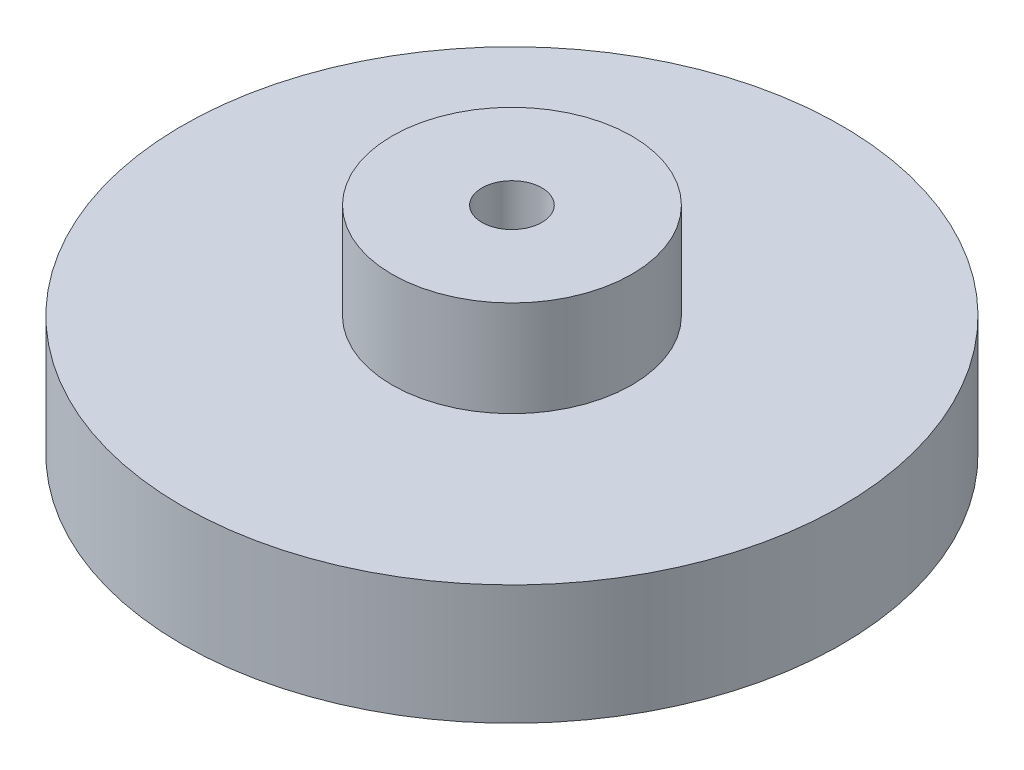
ISO-10303-21;
HEADER;
FILE_DESCRIPTION(('STEP AP214'),'2;1');
FILE_NAME('part.step','',(''),(''),'','','');
FILE_SCHEMA(('AUTOMOTIVE_DESIGN { 1 0 10303 214 1 1 1 1 }'));
ENDSEC;
DATA;
#1=APPLICATION_CONTEXT('core data for automotive mechanical design processes');
#2=APPLICATION_PROTOCOL_DEFINITION('international standard','automotive_design',2000,#1);
#3=PRODUCT_CONTEXT('',#1,'mechanical');
#4=PRODUCT('Part','Part','',(#3));
#5=PRODUCT_RELATED_PRODUCT_CATEGORY('part','',(#4));
#6=PRODUCT_DEFINITION_FORMATION('','',#4);
#7=PRODUCT_DEFINITION_CONTEXT('part definition',#1,'design');
#8=PRODUCT_DEFINITION('design','',#6,#7);
#9=PRODUCT_DEFINITION_SHAPE('','',#8);
#10=(LENGTH_UNIT() NAMED_UNIT(*) SI_UNIT(.MILLI.,.METRE.));
#11=(NAMED_UNIT(*) PLANE_ANGLE_UNIT() SI_UNIT($,.RADIAN.));
#12=(NAMED_UNIT(*) SI_UNIT($,.STERADIAN.) SOLID_ANGLE_UNIT());
#13=UNCERTAINTY_MEASURE_WITH_UNIT(LENGTH_MEASURE(1.E-05),#10,'distance_accuracy_value','');
#14=(GEOMETRIC_REPRESENTATION_CONTEXT(3) GLOBAL_UNCERTAINTY_ASSIGNED_CONTEXT((#13)) GLOBAL_UNIT_ASSIGNED_CONTEXT((#10,
#11,#12)) REPRESENTATION_CONTEXT('',''));
#15=CARTESIAN_POINT('',(0.,0.,0.));
#16=DIRECTION('',(0.,0.,1.));
#17=DIRECTION('',(1.,0.,0.));
#18=AXIS2_PLACEMENT_3D('',#15,#16,#17);
#19=CARTESIAN_POINT('',(0.,10.,0.));
#20=DIRECTION('',(0.,-1.,0.));
#21=DIRECTION('',(0.,0.,-1.));
#22=AXIS2_PLACEMENT_3D('',#19,#20,#21);
#23=CYLINDRICAL_SURFACE('',#22,27.5);
#24=CARTESIAN_POINT('',(0.,10.,0.));
#25=DIRECTION('',(0.,1.,0.));
#26=DIRECTION('',(0.,0.,1.));
#27=AXIS2_PLACEMENT_3D('',#24,#25,#26);
#28=CIRCLE('',#27,27.5);
#29=CARTESIAN_POINT('',(0.,10.,27.5));
#30=VERTEX_POINT('',#29);
#31=EDGE_CURVE('E46',#30,#30,#28,.T.);
#32=ORIENTED_EDGE('',*,*,#31,.F.);
#33=EDGE_LOOP('',(#32));
#34=FACE_BOUND('',#33,.T.);
#35=CARTESIAN_POINT('',(0.,0.,0.));
#36=DIRECTION('',(0.,1.,0.));
#37=DIRECTION('',(0.,0.,1.));
#38=AXIS2_PLACEMENT_3D('',#35,#36,#37);
#39=CIRCLE('',#38,27.5);
#40=CARTESIAN_POINT('',(0.,0.,27.5));
#41=VERTEX_POINT('',#40);
#42=EDGE_CURVE('E42',#41,#41,#39,.T.);
#43=ORIENTED_EDGE('',*,*,#42,.T.);
#44=EDGE_LOOP('',(#43));
#45=FACE_BOUND('',#44,.T.);
#46=ADVANCED_FACE('F39',(#34,#45),#23,.T.);
#47=CARTESIAN_POINT('',(0.,10.,0.));
#48=DIRECTION('',(0.,1.,0.));
#49=DIRECTION('',(0.,0.,1.));
#50=AXIS2_PLACEMENT_3D('',#47,#48,#49);
#51=PLANE('',#50);
#52=CARTESIAN_POINT('',(0.,10.,0.));
#53=DIRECTION('',(0.,1.,0.));
#54=DIRECTION('',(0.,0.,1.));
#55=AXIS2_PLACEMENT_3D('',#52,#53,#54);
#56=CIRCLE('',#55,10.);
#57=CARTESIAN_POINT('',(0.,10.,10.));
#58=VERTEX_POINT('',#57);
#59=EDGE_CURVE('E10',#58,#58,#56,.T.);
#60=ORIENTED_EDGE('',*,*,#59,.F.);
#61=EDGE_LOOP('',(#60));
#62=FACE_BOUND('',#61,.T.);
#63=ORIENTED_EDGE('',*,*,#31,.T.);
#64=EDGE_LOOP('',(#63));
#65=FACE_BOUND('',#64,.T.);
#66=ADVANCED_FACE('F79',(#62,#65),#51,.T.);
#67=CARTESIAN_POINT('',(0.,0.,0.));
#68=DIRECTION('',(0.,1.,0.));
#69=DIRECTION('',(0.,0.,1.));
#70=AXIS2_PLACEMENT_3D('',#67,#68,#69);
#71=PLANE('',#70);
#72=CARTESIAN_POINT('',(0.,0.,0.));
#73=DIRECTION('',(0.,1.,0.));
#74=DIRECTION('',(0.,0.,1.));
#75=AXIS2_PLACEMENT_3D('',#72,#73,#74);
#76=CIRCLE('',#75,2.5);
#77=CARTESIAN_POINT('',(0.,0.,2.5));
#78=VERTEX_POINT('',#77);
#79=EDGE_CURVE('E55',#78,#78,#76,.F.);
#80=ORIENTED_EDGE('',*,*,#79,.F.);
#81=EDGE_LOOP('',(#80));
#82=FACE_BOUND('',#81,.T.);
#83=ORIENTED_EDGE('',*,*,#42,.F.);
#84=EDGE_LOOP('',(#83));
#85=FACE_BOUND('',#84,.T.);
#86=ADVANCED_FACE('F73',(#82,#85),#71,.F.);
#87=CARTESIAN_POINT('',(0.,18.,0.));
#88=DIRECTION('',(0.,-1.,0.));
#89=DIRECTION('',(0.,0.,-1.));
#90=AXIS2_PLACEMENT_3D('',#87,#88,#89);
#91=CYLINDRICAL_SURFACE('',#90,10.);
#92=CARTESIAN_POINT('',(0.,18.,0.));
#93=DIRECTION('',(0.,1.,0.));
#94=DIRECTION('',(0.,0.,1.));
#95=AXIS2_PLACEMENT_3D('',#92,#93,#94);
#96=CIRCLE('',#95,10.);
#97=CARTESIAN_POINT('',(0.,18.,10.));
#98=VERTEX_POINT('',#97);
#99=EDGE_CURVE('E52',#98,#98,#96,.T.);
#100=ORIENTED_EDGE('',*,*,#99,.F.);
#101=EDGE_LOOP('',(#100));
#102=FACE_BOUND('',#101,.T.);
#103=ORIENTED_EDGE('',*,*,#59,.T.);
#104=EDGE_LOOP('',(#103));
#105=FACE_BOUND('',#104,.T.);
#106=ADVANCED_FACE('F68',(#102,#105),#91,.T.);
#107=CARTESIAN_POINT('',(0.,18.,0.));
#108=DIRECTION('',(0.,1.,0.));
#109=DIRECTION('',(0.,0.,1.));
#110=AXIS2_PLACEMENT_3D('',#107,#108,#109);
#111=PLANE('',#110);
#112=CARTESIAN_POINT('',(0.,18.,0.));
#113=DIRECTION('',(0.,1.,0.));
#114=DIRECTION('',(0.,0.,1.));
#115=AXIS2_PLACEMENT_3D('',#112,#113,#114);
#116=CIRCLE('',#115,2.5);
#117=CARTESIAN_POINT('',(0.,18.,2.5));
#118=VERTEX_POINT('',#117);
#119=EDGE_CURVE('E58',#118,#118,#116,.T.);
#120=ORIENTED_EDGE('',*,*,#119,.F.);
#121=EDGE_LOOP('',(#120));
#122=FACE_BOUND('',#121,.T.);
#123=ORIENTED_EDGE('',*,*,#99,.T.);
#124=EDGE_LOOP('',(#123));
#125=FACE_BOUND('',#124,.T.);
#126=ADVANCED_FACE('F65',(#122,#125),#111,.T.);
#127=CARTESIAN_POINT('',(0.,-0.001000000000001,0.));
#128=DIRECTION('',(0.,1.,0.));
#129=DIRECTION('',(0.,0.,1.));
#130=AXIS2_PLACEMENT_3D('',#127,#128,#129);
#131=CYLINDRICAL_SURFACE('',#130,2.5);
#132=ORIENTED_EDGE('',*,*,#119,.T.);
#133=EDGE_LOOP('',(#132));
#134=FACE_BOUND('',#133,.T.);
#135=ORIENTED_EDGE('',*,*,#79,.T.);
#136=EDGE_LOOP('',(#135));
#137=FACE_BOUND('',#136,.T.);
#138=ADVANCED_FACE('F62',(#134,#137),#131,.F.);
#139=CLOSED_SHELL('',(#46,#66,#86,#106,#126,#138));
#140=MANIFOLD_SOLID_BREP('B2',#139);
#141=ADVANCED_BREP_SHAPE_REPRESENTATION('',(#18,#140),#14);
#142=SHAPE_DEFINITION_REPRESENTATION(#9,#141);
ENDSEC;
END-ISO-10303-21;
